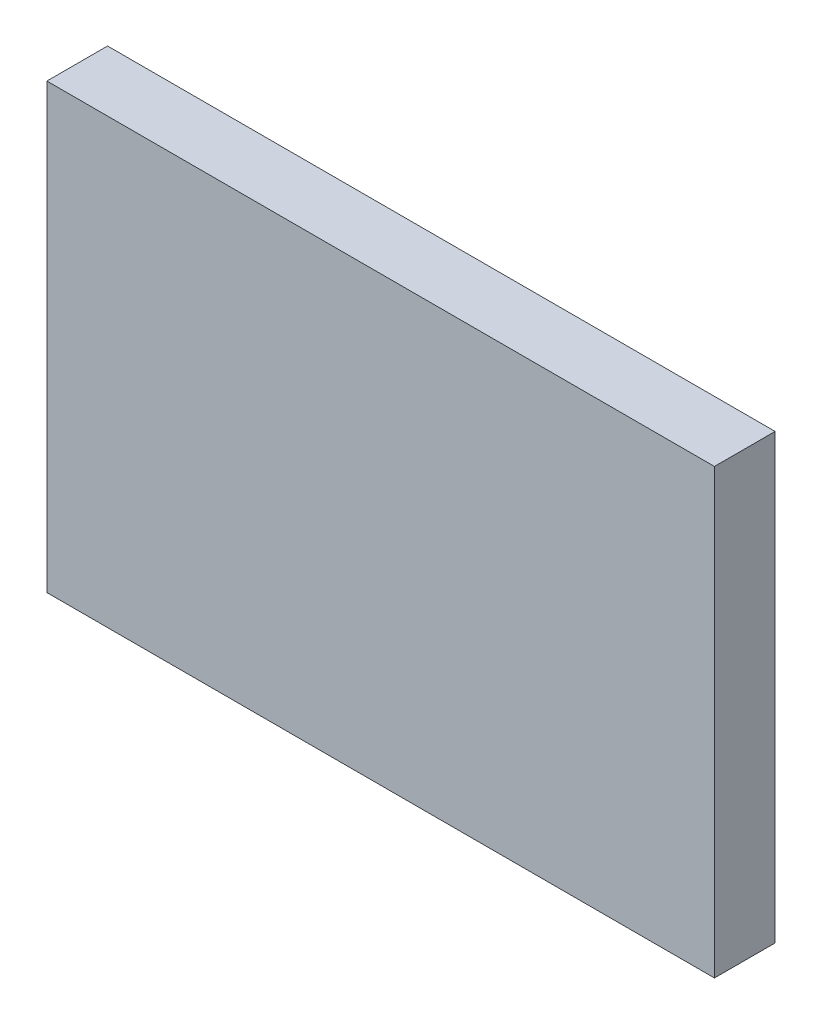
ISO-10303-21;
HEADER;
FILE_DESCRIPTION(('STEP AP214'),'2;1');
FILE_NAME('part.step','',(''),(''),'','','');
FILE_SCHEMA(('AUTOMOTIVE_DESIGN { 1 0 10303 214 1 1 1 1 }'));
ENDSEC;
DATA;
#1=APPLICATION_CONTEXT('core data for automotive mechanical design processes');
#2=APPLICATION_PROTOCOL_DEFINITION('international standard','automotive_design',2000,#1);
#3=PRODUCT_CONTEXT('',#1,'mechanical');
#4=PRODUCT('Part','Part','',(#3));
#5=PRODUCT_RELATED_PRODUCT_CATEGORY('part','',(#4));
#6=PRODUCT_DEFINITION_FORMATION('','',#4);
#7=PRODUCT_DEFINITION_CONTEXT('part definition',#1,'design');
#8=PRODUCT_DEFINITION('design','',#6,#7);
#9=PRODUCT_DEFINITION_SHAPE('','',#8);
#10=(LENGTH_UNIT() NAMED_UNIT(*) SI_UNIT(.MILLI.,.METRE.));
#11=(NAMED_UNIT(*) PLANE_ANGLE_UNIT() SI_UNIT($,.RADIAN.));
#12=(NAMED_UNIT(*) SI_UNIT($,.STERADIAN.) SOLID_ANGLE_UNIT());
#13=UNCERTAINTY_MEASURE_WITH_UNIT(LENGTH_MEASURE(1.E-05),#10,'distance_accuracy_value','');
#14=(GEOMETRIC_REPRESENTATION_CONTEXT(3) GLOBAL_UNCERTAINTY_ASSIGNED_CONTEXT((#13)) GLOBAL_UNIT_ASSIGNED_CONTEXT((#10,
#11,#12)) REPRESENTATION_CONTEXT('',''));
#15=CARTESIAN_POINT('',(0.,0.,0.));
#16=DIRECTION('',(0.,0.,1.));
#17=DIRECTION('',(1.,0.,0.));
#18=AXIS2_PLACEMENT_3D('',#15,#16,#17);
#19=CARTESIAN_POINT('',(0.,0.,0.));
#20=DIRECTION('',(0.,0.,1.));
#21=DIRECTION('',(1.,0.,0.));
#22=AXIS2_PLACEMENT_3D('',#19,#20,#21);
#23=PLANE('',#22);
#24=DIRECTION('',(1.,0.,0.));
#25=VECTOR('',#24,1.);
#26=CARTESIAN_POINT('',(-5500.,3650.,0.));
#27=LINE('',#26,#25);
#28=CARTESIAN_POINT('',(-5500.,3650.,0.));
#29=VERTEX_POINT('',#28);
#30=CARTESIAN_POINT('',(5500.,3650.,0.));
#31=VERTEX_POINT('',#30);
#32=EDGE_CURVE('E28',#29,#31,#27,.T.);
#33=ORIENTED_EDGE('',*,*,#32,.F.);
#34=DIRECTION('',(0.,1.,0.));
#35=VECTOR('',#34,1.);
#36=CARTESIAN_POINT('',(-5500.,-3650.,0.));
#37=LINE('',#36,#35);
#38=CARTESIAN_POINT('',(-5500.,-3650.,0.));
#39=VERTEX_POINT('',#38);
#40=EDGE_CURVE('E94',#39,#29,#37,.T.);
#41=ORIENTED_EDGE('',*,*,#40,.F.);
#42=DIRECTION('',(-1.,0.,0.));
#43=VECTOR('',#42,1.);
#44=CARTESIAN_POINT('',(5500.,-3650.,0.));
#45=LINE('',#44,#43);
#46=CARTESIAN_POINT('',(5500.,-3650.,0.));
#47=VERTEX_POINT('',#46);
#48=EDGE_CURVE('E86',#47,#39,#45,.T.);
#49=ORIENTED_EDGE('',*,*,#48,.F.);
#50=DIRECTION('',(0.,-1.,0.));
#51=VECTOR('',#50,1.);
#52=CARTESIAN_POINT('',(5500.,3650.,0.));
#53=LINE('',#52,#51);
#54=EDGE_CURVE('E72',#31,#47,#53,.T.);
#55=ORIENTED_EDGE('',*,*,#54,.F.);
#56=EDGE_LOOP('',(#33,#41,#49,#55));
#57=FACE_BOUND('',#56,.T.);
#58=ADVANCED_FACE('F17',(#57),#23,.T.);
#59=CARTESIAN_POINT('',(0.,0.,-1000.));
#60=DIRECTION('',(0.,0.,-1.));
#61=DIRECTION('',(0.,-1.,0.));
#62=AXIS2_PLACEMENT_3D('',#59,#60,#61);
#63=PLANE('',#62);
#64=DIRECTION('',(1.,0.,0.));
#65=VECTOR('',#64,1.);
#66=CARTESIAN_POINT('',(-5500.,3650.,-1000.));
#67=LINE('',#66,#65);
#68=CARTESIAN_POINT('',(-5500.,3650.,-1000.));
#69=VERTEX_POINT('',#68);
#70=CARTESIAN_POINT('',(5500.,3650.,-1000.));
#71=VERTEX_POINT('',#70);
#72=EDGE_CURVE('E11',#69,#71,#67,.T.);
#73=ORIENTED_EDGE('',*,*,#72,.T.);
#74=DIRECTION('',(0.,-1.,0.));
#75=VECTOR('',#74,1.);
#76=CARTESIAN_POINT('',(5500.,3650.,-1000.));
#77=LINE('',#76,#75);
#78=CARTESIAN_POINT('',(5500.,-3650.,-1000.));
#79=VERTEX_POINT('',#78);
#80=EDGE_CURVE('E62',#71,#79,#77,.T.);
#81=ORIENTED_EDGE('',*,*,#80,.T.);
#82=DIRECTION('',(-1.,0.,0.));
#83=VECTOR('',#82,1.);
#84=CARTESIAN_POINT('',(5500.,-3650.,-1000.));
#85=LINE('',#84,#83);
#86=CARTESIAN_POINT('',(-5500.,-3650.,-1000.));
#87=VERTEX_POINT('',#86);
#88=EDGE_CURVE('E66',#79,#87,#85,.T.);
#89=ORIENTED_EDGE('',*,*,#88,.T.);
#90=DIRECTION('',(0.,1.,0.));
#91=VECTOR('',#90,1.);
#92=CARTESIAN_POINT('',(-5500.,-3650.,-1000.));
#93=LINE('',#92,#91);
#94=EDGE_CURVE('E99',#87,#69,#93,.T.);
#95=ORIENTED_EDGE('',*,*,#94,.T.);
#96=EDGE_LOOP('',(#73,#81,#89,#95));
#97=FACE_BOUND('',#96,.T.);
#98=ADVANCED_FACE('F64',(#97),#63,.T.);
#99=CARTESIAN_POINT('',(-5500.,3650.,0.));
#100=DIRECTION('',(0.,1.,0.));
#101=DIRECTION('',(1.,0.,0.));
#102=AXIS2_PLACEMENT_3D('',#99,#100,#101);
#103=PLANE('',#102);
#104=ORIENTED_EDGE('',*,*,#32,.T.);
#105=DIRECTION('',(0.,0.,-1.));
#106=VECTOR('',#105,1.);
#107=CARTESIAN_POINT('',(5500.,3650.,0.));
#108=LINE('',#107,#106);
#109=EDGE_CURVE('E71',#31,#71,#108,.T.);
#110=ORIENTED_EDGE('',*,*,#109,.T.);
#111=ORIENTED_EDGE('',*,*,#72,.F.);
#112=DIRECTION('',(0.,0.,-1.));
#113=VECTOR('',#112,1.);
#114=CARTESIAN_POINT('',(-5500.,3650.,0.));
#115=LINE('',#114,#113);
#116=EDGE_CURVE('E98',#29,#69,#115,.T.);
#117=ORIENTED_EDGE('',*,*,#116,.F.);
#118=EDGE_LOOP('',(#104,#110,#111,#117));
#119=FACE_BOUND('',#118,.T.);
#120=ADVANCED_FACE('F115',(#119),#103,.T.);
#121=CARTESIAN_POINT('',(5500.,3650.,0.));
#122=DIRECTION('',(1.,0.,0.));
#123=DIRECTION('',(0.,1.,0.));
#124=AXIS2_PLACEMENT_3D('',#121,#122,#123);
#125=PLANE('',#124);
#126=ORIENTED_EDGE('',*,*,#54,.T.);
#127=DIRECTION('',(0.,0.,-1.));
#128=VECTOR('',#127,1.);
#129=CARTESIAN_POINT('',(5500.,-3650.,0.));
#130=LINE('',#129,#128);
#131=EDGE_CURVE('E75',#47,#79,#130,.T.);
#132=ORIENTED_EDGE('',*,*,#131,.T.);
#133=ORIENTED_EDGE('',*,*,#80,.F.);
#134=ORIENTED_EDGE('',*,*,#109,.F.);
#135=EDGE_LOOP('',(#126,#132,#133,#134));
#136=FACE_BOUND('',#135,.T.);
#137=ADVANCED_FACE('F76',(#136),#125,.T.);
#138=CARTESIAN_POINT('',(5500.,-3650.,0.));
#139=DIRECTION('',(0.,-1.,0.));
#140=DIRECTION('',(0.,0.,-1.));
#141=AXIS2_PLACEMENT_3D('',#138,#139,#140);
#142=PLANE('',#141);
#143=ORIENTED_EDGE('',*,*,#48,.T.);
#144=DIRECTION('',(0.,0.,-1.));
#145=VECTOR('',#144,1.);
#146=CARTESIAN_POINT('',(-5500.,-3650.,0.));
#147=LINE('',#146,#145);
#148=EDGE_CURVE('E21',#39,#87,#147,.T.);
#149=ORIENTED_EDGE('',*,*,#148,.T.);
#150=ORIENTED_EDGE('',*,*,#88,.F.);
#151=ORIENTED_EDGE('',*,*,#131,.F.);
#152=EDGE_LOOP('',(#143,#149,#150,#151));
#153=FACE_BOUND('',#152,.T.);
#154=ADVANCED_FACE('F82',(#153),#142,.T.);
#155=CARTESIAN_POINT('',(-5500.,-3650.,0.));
#156=DIRECTION('',(-1.,0.,0.));
#157=DIRECTION('',(0.,0.,1.));
#158=AXIS2_PLACEMENT_3D('',#155,#156,#157);
#159=PLANE('',#158);
#160=ORIENTED_EDGE('',*,*,#40,.T.);
#161=ORIENTED_EDGE('',*,*,#116,.T.);
#162=ORIENTED_EDGE('',*,*,#94,.F.);
#163=ORIENTED_EDGE('',*,*,#148,.F.);
#164=EDGE_LOOP('',(#160,#161,#162,#163));
#165=FACE_BOUND('',#164,.T.);
#166=ADVANCED_FACE('F19',(#165),#159,.T.);
#167=CLOSED_SHELL('',(#58,#98,#120,#137,#154,#166));
#168=MANIFOLD_SOLID_BREP('B1',#167);
#169=ADVANCED_BREP_SHAPE_REPRESENTATION('',(#18,#168),#14);
#170=SHAPE_DEFINITION_REPRESENTATION(#9,#169);
ENDSEC;
END-ISO-10303-21;
